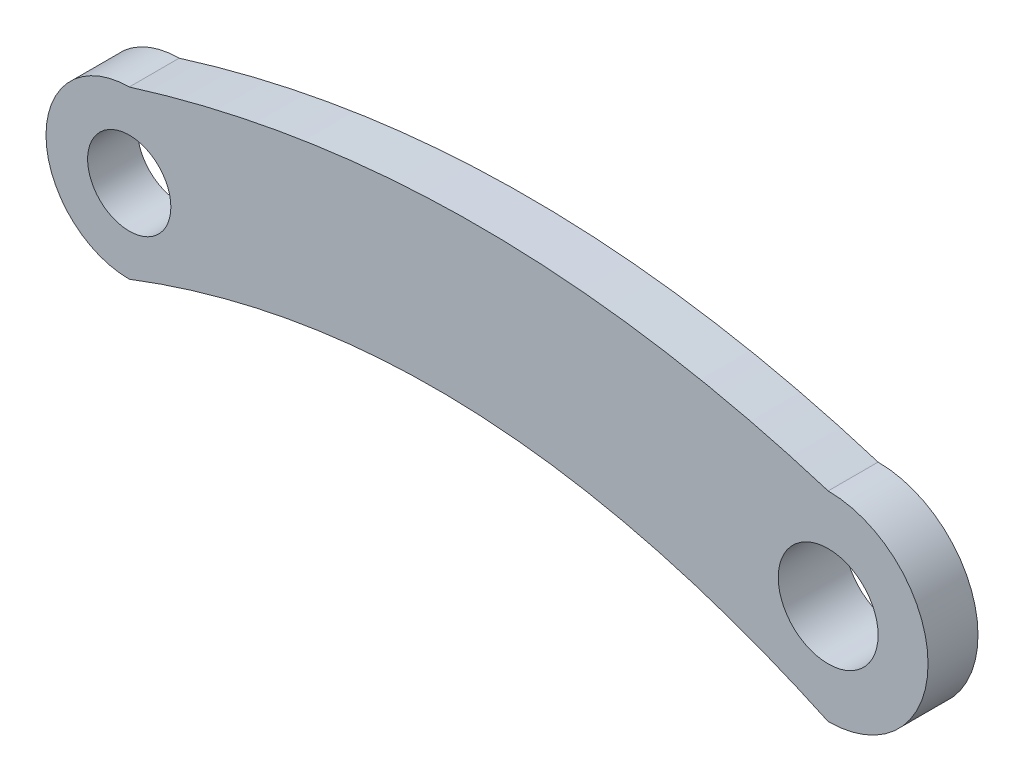
ISO-10303-21;
HEADER;
FILE_DESCRIPTION(('STEP AP214'),'2;1');
FILE_NAME('part.step','',(''),(''),'','','');
FILE_SCHEMA(('AUTOMOTIVE_DESIGN { 1 0 10303 214 1 1 1 1 }'));
ENDSEC;
DATA;
#1=APPLICATION_CONTEXT('core data for automotive mechanical design processes');
#2=APPLICATION_PROTOCOL_DEFINITION('international standard','automotive_design',2000,#1);
#3=PRODUCT_CONTEXT('',#1,'mechanical');
#4=PRODUCT('Part','Part','',(#3));
#5=PRODUCT_RELATED_PRODUCT_CATEGORY('part','',(#4));
#6=PRODUCT_DEFINITION_FORMATION('','',#4);
#7=PRODUCT_DEFINITION_CONTEXT('part definition',#1,'design');
#8=PRODUCT_DEFINITION('design','',#6,#7);
#9=PRODUCT_DEFINITION_SHAPE('','',#8);
#10=(LENGTH_UNIT() NAMED_UNIT(*) SI_UNIT(.MILLI.,.METRE.));
#11=(NAMED_UNIT(*) PLANE_ANGLE_UNIT() SI_UNIT($,.RADIAN.));
#12=(NAMED_UNIT(*) SI_UNIT($,.STERADIAN.) SOLID_ANGLE_UNIT());
#13=UNCERTAINTY_MEASURE_WITH_UNIT(LENGTH_MEASURE(1.E-05),#10,'distance_accuracy_value','');
#14=(GEOMETRIC_REPRESENTATION_CONTEXT(3) GLOBAL_UNCERTAINTY_ASSIGNED_CONTEXT((#13)) GLOBAL_UNIT_ASSIGNED_CONTEXT((#10,
#11,#12)) REPRESENTATION_CONTEXT('',''));
#15=CARTESIAN_POINT('',(0.,0.,0.));
#16=DIRECTION('',(0.,0.,1.));
#17=DIRECTION('',(1.,0.,0.));
#18=AXIS2_PLACEMENT_3D('',#15,#16,#17);
#19=CARTESIAN_POINT('',(-39.0336401582858,318.182260644904,13.2273408249186));
#20=DIRECTION('',(0.,0.,1.));
#21=DIRECTION('',(1.,0.,0.));
#22=AXIS2_PLACEMENT_3D('',#19,#20,#21);
#23=PLANE('',#22);
#24=CARTESIAN_POINT('',(-65.8069725656887,351.830272054238,13.2273408249186));
#25=DIRECTION('',(0.,0.,1.));
#26=DIRECTION('',(1.,0.,0.));
#27=AXIS2_PLACEMENT_3D('',#24,#25,#26);
#28=CIRCLE('',#27,5.);
#29=CARTESIAN_POINT('',(-65.8069725656887,356.830272054238,13.2273408249186));
#30=VERTEX_POINT('',#29);
#31=CARTESIAN_POINT('',(-65.8069725656887,346.830272054238,13.2273408249186));
#32=VERTEX_POINT('',#31);
#33=EDGE_CURVE('E120',#30,#32,#28,.T.);
#34=ORIENTED_EDGE('',*,*,#33,.F.);
#35=CARTESIAN_POINT('',(-65.8069725656887,356.830272054238,13.2273408249186));
#36=CARTESIAN_POINT('',(-44.8713294361293,363.368852060951,13.2273408249186));
#37=CARTESIAN_POINT('',(-23.8193827356207,356.809340978223,13.2273408249186));
#38=B_SPLINE_CURVE_WITH_KNOTS('',2,(#35,#36,#37),.UNSPECIFIED.,.F.,.F.,(3,3),(0.,1.),.UNSPECIFIED.);
#39=CARTESIAN_POINT('',(-23.8193827356207,356.809340978224,13.2273408249186));
#40=VERTEX_POINT('',#39);
#41=EDGE_CURVE('E185',#30,#40,#38,.T.);
#42=ORIENTED_EDGE('',*,*,#41,.T.);
#43=CARTESIAN_POINT('',(-23.8193827356207,350.809340978223,13.2273408249186));
#44=DIRECTION('',(0.,0.,1.));
#45=DIRECTION('',(1.,0.,0.));
#46=AXIS2_PLACEMENT_3D('',#43,#44,#45);
#47=CIRCLE('',#46,6.00000000000038);
#48=CARTESIAN_POINT('',(-23.8193827356207,344.809340978223,13.2273408249186));
#49=VERTEX_POINT('',#48);
#50=EDGE_CURVE('E182',#40,#49,#47,.F.);
#51=ORIENTED_EDGE('',*,*,#50,.T.);
#52=CARTESIAN_POINT('',(-65.8069725656887,346.830272054238,13.2273408249186));
#53=CARTESIAN_POINT('',(-45.1872701460701,354.758124051588,13.2273408249186));
#54=CARTESIAN_POINT('',(-23.8193827356207,344.809340978223,13.2273408249186));
#55=B_SPLINE_CURVE_WITH_KNOTS('',2,(#52,#53,#54),.UNSPECIFIED.,.F.,.F.,(3,3),(0.,1.),.UNSPECIFIED.);
#56=EDGE_CURVE('E103',#32,#49,#55,.T.);
#57=ORIENTED_EDGE('',*,*,#56,.F.);
#58=EDGE_LOOP('',(#34,#42,#51,#57));
#59=FACE_BOUND('',#58,.T.);
#60=CARTESIAN_POINT('',(-65.8069725656887,351.830272054238,13.2273408249186));
#61=DIRECTION('',(0.,0.,1.));
#62=DIRECTION('',(1.,0.,0.));
#63=AXIS2_PLACEMENT_3D('',#60,#61,#62);
#64=CIRCLE('',#63,2.5);
#65=CARTESIAN_POINT('',(-63.3069725656887,351.830272054238,13.2273408249186));
#66=VERTEX_POINT('',#65);
#67=EDGE_CURVE('E145',#66,#66,#64,.T.);
#68=ORIENTED_EDGE('',*,*,#67,.T.);
#69=EDGE_LOOP('',(#68));
#70=FACE_BOUND('',#69,.T.);
#71=CARTESIAN_POINT('',(-23.8193827356207,350.809340978223,13.2273408249186));
#72=DIRECTION('',(0.,0.,1.));
#73=DIRECTION('',(1.,0.,0.));
#74=AXIS2_PLACEMENT_3D('',#71,#72,#73);
#75=CIRCLE('',#74,4.);
#76=CARTESIAN_POINT('',(-19.8193827356207,350.809340978223,13.2273408249186));
#77=VERTEX_POINT('',#76);
#78=EDGE_CURVE('E12',#77,#77,#75,.F.);
#79=ORIENTED_EDGE('',*,*,#78,.F.);
#80=EDGE_LOOP('',(#79));
#81=FACE_BOUND('',#80,.T.);
#82=ADVANCED_FACE('F42',(#59,#70,#81),#23,.F.);
#83=CARTESIAN_POINT('',(-65.8069725656887,351.830272054238,16.2273408249186));
#84=DIRECTION('',(0.,0.,-1.));
#85=DIRECTION('',(-1.,0.,0.));
#86=AXIS2_PLACEMENT_3D('',#83,#84,#85);
#87=CYLINDRICAL_SURFACE('',#86,5.);
#88=ORIENTED_EDGE('',*,*,#33,.T.);
#89=DIRECTION('',(0.,0.,-1.));
#90=VECTOR('',#89,1.);
#91=CARTESIAN_POINT('',(-65.8069725656887,346.830272054238,16.2273408249186));
#92=LINE('',#91,#90);
#93=CARTESIAN_POINT('',(-65.8069725656887,346.830272054238,16.2273408249186));
#94=VERTEX_POINT('',#93);
#95=EDGE_CURVE('E52',#94,#32,#92,.T.);
#96=ORIENTED_EDGE('',*,*,#95,.F.);
#97=CARTESIAN_POINT('',(-65.8069725656887,351.830272054238,16.2273408249186));
#98=DIRECTION('',(0.,0.,1.));
#99=DIRECTION('',(1.,0.,0.));
#100=AXIS2_PLACEMENT_3D('',#97,#98,#99);
#101=CIRCLE('',#100,5.);
#102=CARTESIAN_POINT('',(-65.8069725656887,356.830272054238,16.2273408249186));
#103=VERTEX_POINT('',#102);
#104=EDGE_CURVE('E95',#103,#94,#101,.T.);
#105=ORIENTED_EDGE('',*,*,#104,.F.);
#106=DIRECTION('',(0.,0.,-1.));
#107=VECTOR('',#106,1.);
#108=CARTESIAN_POINT('',(-65.8069725656887,356.830272054238,16.2273408249186));
#109=LINE('',#108,#107);
#110=EDGE_CURVE('E62',#103,#30,#109,.T.);
#111=ORIENTED_EDGE('',*,*,#110,.T.);
#112=EDGE_LOOP('',(#88,#96,#105,#111));
#113=FACE_BOUND('',#112,.T.);
#114=ADVANCED_FACE('F46',(#113),#87,.T.);
#115=CARTESIAN_POINT('',(-65.8069725656887,346.830272054238,16.2273408249186));
#116=CARTESIAN_POINT('',(-45.1872701460701,354.758124051588,16.2273408249186));
#117=CARTESIAN_POINT('',(-23.8193827356207,344.809340978223,16.2273408249186));
#118=B_SPLINE_CURVE_WITH_KNOTS('',2,(#115,#116,#117),.UNSPECIFIED.,.F.,.F.,(3,3),(0.,1.),.UNSPECIFIED.);
#119=DIRECTION('',(0.,0.,-1.));
#120=VECTOR('',#119,1.);
#121=SURFACE_OF_LINEAR_EXTRUSION('',#118,#120);
#122=ORIENTED_EDGE('',*,*,#56,.T.);
#123=DIRECTION('',(0.,0.,-1.));
#124=VECTOR('',#123,1.);
#125=CARTESIAN_POINT('',(-23.8193827356207,344.809340978223,16.2273408249186));
#126=LINE('',#125,#124);
#127=CARTESIAN_POINT('',(-23.8193827356207,344.809340978223,16.2273408249186));
#128=VERTEX_POINT('',#127);
#129=EDGE_CURVE('E100',#128,#49,#126,.T.);
#130=ORIENTED_EDGE('',*,*,#129,.F.);
#131=EDGE_CURVE('E90',#94,#128,#118,.T.);
#132=ORIENTED_EDGE('',*,*,#131,.F.);
#133=ORIENTED_EDGE('',*,*,#95,.T.);
#134=EDGE_LOOP('',(#122,#130,#132,#133));
#135=FACE_BOUND('',#134,.T.);
#136=ADVANCED_FACE('F99',(#135),#121,.F.);
#137=CARTESIAN_POINT('',(-23.8193827356207,350.809340978223,16.2273408249186));
#138=DIRECTION('',(0.,0.,-1.));
#139=DIRECTION('',(-1.,0.,0.));
#140=AXIS2_PLACEMENT_3D('',#137,#138,#139);
#141=CYLINDRICAL_SURFACE('',#140,6.00000000000038);
#142=ORIENTED_EDGE('',*,*,#50,.F.);
#143=DIRECTION('',(0.,0.,-1.));
#144=VECTOR('',#143,1.);
#145=CARTESIAN_POINT('',(-23.8193827356207,356.809340978224,16.2273408249186));
#146=LINE('',#145,#144);
#147=CARTESIAN_POINT('',(-23.8193827356207,356.809340978224,16.2273408249186));
#148=VERTEX_POINT('',#147);
#149=EDGE_CURVE('E75',#148,#40,#146,.T.);
#150=ORIENTED_EDGE('',*,*,#149,.F.);
#151=CARTESIAN_POINT('',(-23.8193827356207,350.809340978223,16.2273408249186));
#152=DIRECTION('',(0.,0.,1.));
#153=DIRECTION('',(1.,0.,0.));
#154=AXIS2_PLACEMENT_3D('',#151,#152,#153);
#155=CIRCLE('',#154,6.00000000000038);
#156=EDGE_CURVE('E93',#148,#128,#155,.F.);
#157=ORIENTED_EDGE('',*,*,#156,.T.);
#158=ORIENTED_EDGE('',*,*,#129,.T.);
#159=EDGE_LOOP('',(#142,#150,#157,#158));
#160=FACE_BOUND('',#159,.T.);
#161=ADVANCED_FACE('F102',(#160),#141,.T.);
#162=CARTESIAN_POINT('',(-65.8069725656887,356.830272054238,16.2273408249186));
#163=CARTESIAN_POINT('',(-44.8713294361293,363.368852060951,16.2273408249186));
#164=CARTESIAN_POINT('',(-23.8193827356207,356.809340978223,16.2273408249186));
#165=B_SPLINE_CURVE_WITH_KNOTS('',2,(#162,#163,#164),.UNSPECIFIED.,.F.,.F.,(3,3),(0.,1.),.UNSPECIFIED.);
#166=DIRECTION('',(0.,0.,-1.));
#167=VECTOR('',#166,1.);
#168=SURFACE_OF_LINEAR_EXTRUSION('',#165,#167);
#169=ORIENTED_EDGE('',*,*,#41,.F.);
#170=ORIENTED_EDGE('',*,*,#110,.F.);
#171=EDGE_CURVE('E106',#103,#148,#165,.T.);
#172=ORIENTED_EDGE('',*,*,#171,.T.);
#173=ORIENTED_EDGE('',*,*,#149,.T.);
#174=EDGE_LOOP('',(#169,#170,#172,#173));
#175=FACE_BOUND('',#174,.T.);
#176=ADVANCED_FACE('F124',(#175),#168,.T.);
#177=CARTESIAN_POINT('',(-39.0336401582858,318.182260644904,16.2273408249186));
#178=DIRECTION('',(0.,0.,1.));
#179=DIRECTION('',(1.,0.,0.));
#180=AXIS2_PLACEMENT_3D('',#177,#178,#179);
#181=PLANE('',#180);
#182=CARTESIAN_POINT('',(-65.8069725656887,351.830272054238,16.2273408249186));
#183=DIRECTION('',(0.,0.,1.));
#184=DIRECTION('',(1.,0.,0.));
#185=AXIS2_PLACEMENT_3D('',#182,#183,#184);
#186=CIRCLE('',#185,2.5);
#187=CARTESIAN_POINT('',(-63.3069725656887,351.830272054238,16.2273408249186));
#188=VERTEX_POINT('',#187);
#189=EDGE_CURVE('E171',#188,#188,#186,.T.);
#190=ORIENTED_EDGE('',*,*,#189,.F.);
#191=EDGE_LOOP('',(#190));
#192=FACE_BOUND('',#191,.T.);
#193=CARTESIAN_POINT('',(-23.8193827356207,350.809340978223,16.2273408249186));
#194=DIRECTION('',(0.,0.,1.));
#195=DIRECTION('',(1.,0.,0.));
#196=AXIS2_PLACEMENT_3D('',#193,#194,#195);
#197=CIRCLE('',#196,3.);
#198=CARTESIAN_POINT('',(-20.8193827356207,350.809340978223,16.2273408249186));
#199=VERTEX_POINT('',#198);
#200=EDGE_CURVE('E172',#199,#199,#197,.T.);
#201=ORIENTED_EDGE('',*,*,#200,.F.);
#202=EDGE_LOOP('',(#201));
#203=FACE_BOUND('',#202,.T.);
#204=ORIENTED_EDGE('',*,*,#104,.T.);
#205=ORIENTED_EDGE('',*,*,#131,.T.);
#206=ORIENTED_EDGE('',*,*,#156,.F.);
#207=ORIENTED_EDGE('',*,*,#171,.F.);
#208=EDGE_LOOP('',(#204,#205,#206,#207));
#209=FACE_BOUND('',#208,.T.);
#210=ADVANCED_FACE('F91',(#192,#203,#209),#181,.T.);
#211=CARTESIAN_POINT('',(-23.8193827356207,350.809340978223,16.2273408249186));
#212=DIRECTION('',(0.,0.,-1.));
#213=DIRECTION('',(-1.,0.,0.));
#214=AXIS2_PLACEMENT_3D('',#211,#212,#213);
#215=CYLINDRICAL_SURFACE('',#214,3.);
#216=ORIENTED_EDGE('',*,*,#200,.T.);
#217=EDGE_LOOP('',(#216));
#218=FACE_BOUND('',#217,.T.);
#219=CARTESIAN_POINT('',(-23.8193827356207,350.809340978223,12.2273408249186));
#220=DIRECTION('',(0.,0.,-1.));
#221=DIRECTION('',(-1.,0.,0.));
#222=AXIS2_PLACEMENT_3D('',#219,#220,#221);
#223=CIRCLE('',#222,3.);
#224=CARTESIAN_POINT('',(-26.8193827356207,350.809340978223,12.2273408249186));
#225=VERTEX_POINT('',#224);
#226=EDGE_CURVE('E177',#225,#225,#223,.T.);
#227=ORIENTED_EDGE('',*,*,#226,.T.);
#228=EDGE_LOOP('',(#227));
#229=FACE_BOUND('',#228,.T.);
#230=ADVANCED_FACE('F160',(#218,#229),#215,.F.);
#231=CARTESIAN_POINT('',(-65.8069725656887,351.830272054238,16.2273408249186));
#232=DIRECTION('',(0.,0.,-1.));
#233=DIRECTION('',(-1.,0.,0.));
#234=AXIS2_PLACEMENT_3D('',#231,#232,#233);
#235=CYLINDRICAL_SURFACE('',#234,2.5);
#236=ORIENTED_EDGE('',*,*,#189,.T.);
#237=EDGE_LOOP('',(#236));
#238=FACE_BOUND('',#237,.T.);
#239=ORIENTED_EDGE('',*,*,#67,.F.);
#240=EDGE_LOOP('',(#239));
#241=FACE_BOUND('',#240,.T.);
#242=ADVANCED_FACE('F154',(#238,#241),#235,.F.);
#243=CARTESIAN_POINT('',(-23.8193827356207,350.809340978223,12.2273408249186));
#244=DIRECTION('',(0.,0.,-1.));
#245=DIRECTION('',(-1.,0.,0.));
#246=AXIS2_PLACEMENT_3D('',#243,#244,#245);
#247=PLANE('',#246);
#248=CARTESIAN_POINT('',(-23.8193827356207,350.809340978223,12.2273408249186));
#249=DIRECTION('',(0.,0.,-1.));
#250=DIRECTION('',(-1.,0.,0.));
#251=AXIS2_PLACEMENT_3D('',#248,#249,#250);
#252=CIRCLE('',#251,4.);
#253=CARTESIAN_POINT('',(-27.8193827356207,350.809340978223,12.2273408249186));
#254=VERTEX_POINT('',#253);
#255=EDGE_CURVE('E174',#254,#254,#252,.T.);
#256=ORIENTED_EDGE('',*,*,#255,.T.);
#257=EDGE_LOOP('',(#256));
#258=FACE_BOUND('',#257,.T.);
#259=ORIENTED_EDGE('',*,*,#226,.F.);
#260=EDGE_LOOP('',(#259));
#261=FACE_BOUND('',#260,.T.);
#262=ADVANCED_FACE('F150',(#258,#261),#247,.T.);
#263=CARTESIAN_POINT('',(-23.8193827356207,350.809340978223,12.2273408249186));
#264=DIRECTION('',(0.,0.,1.));
#265=DIRECTION('',(1.,0.,0.));
#266=AXIS2_PLACEMENT_3D('',#263,#264,#265);
#267=CYLINDRICAL_SURFACE('',#266,4.);
#268=ORIENTED_EDGE('',*,*,#255,.F.);
#269=EDGE_LOOP('',(#268));
#270=FACE_BOUND('',#269,.T.);
#271=ORIENTED_EDGE('',*,*,#78,.T.);
#272=EDGE_LOOP('',(#271));
#273=FACE_BOUND('',#272,.T.);
#274=ADVANCED_FACE('F143',(#270,#273),#267,.T.);
#275=CLOSED_SHELL('',(#82,#114,#136,#161,#176,#210,#230,#242,#262,#274));
#276=MANIFOLD_SOLID_BREP('B2',#275);
#277=ADVANCED_BREP_SHAPE_REPRESENTATION('',(#18,#276),#14);
#278=SHAPE_DEFINITION_REPRESENTATION(#9,#277);
ENDSEC;
END-ISO-10303-21;
